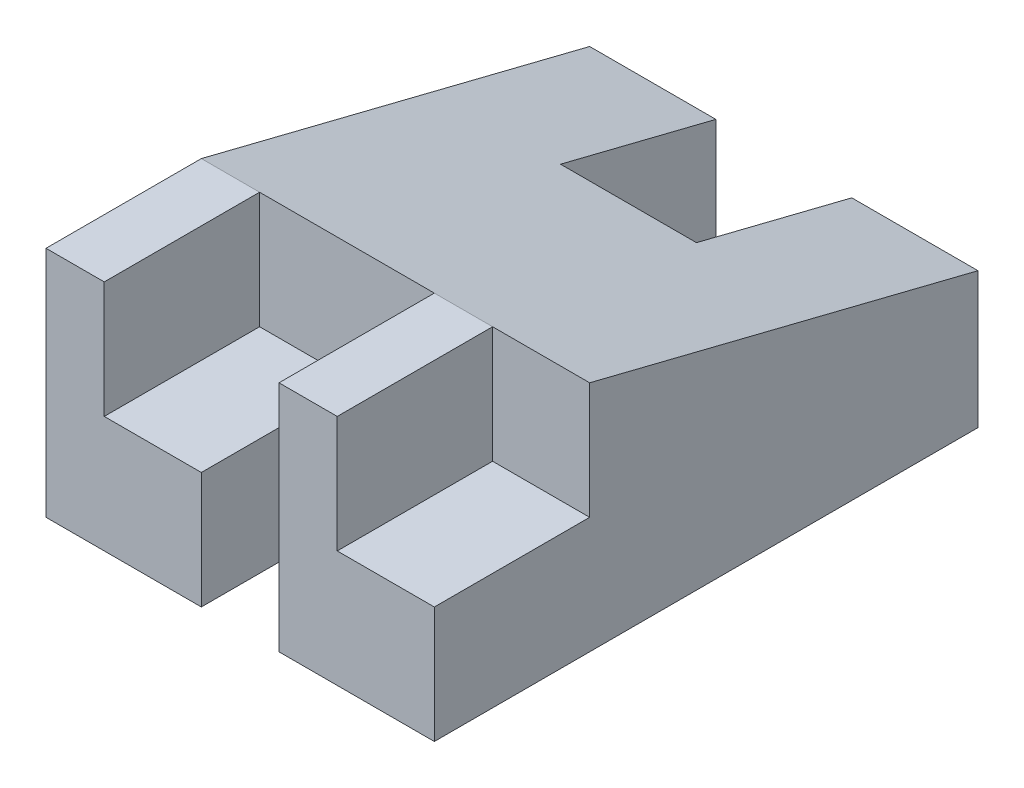
ISO-10303-21;
HEADER;
FILE_DESCRIPTION(('STEP AP214'),'2;1');
FILE_NAME('part.step','',(''),(''),'','','');
FILE_SCHEMA(('AUTOMOTIVE_DESIGN { 1 0 10303 214 1 1 1 1 }'));
ENDSEC;
DATA;
#1=APPLICATION_CONTEXT('core data for automotive mechanical design processes');
#2=APPLICATION_PROTOCOL_DEFINITION('international standard','automotive_design',2000,#1);
#3=PRODUCT_CONTEXT('',#1,'mechanical');
#4=PRODUCT('Part','Part','',(#3));
#5=PRODUCT_RELATED_PRODUCT_CATEGORY('part','',(#4));
#6=PRODUCT_DEFINITION_FORMATION('','',#4);
#7=PRODUCT_DEFINITION_CONTEXT('part definition',#1,'design');
#8=PRODUCT_DEFINITION('design','',#6,#7);
#9=PRODUCT_DEFINITION_SHAPE('','',#8);
#10=(LENGTH_UNIT() NAMED_UNIT(*) SI_UNIT(.MILLI.,.METRE.));
#11=(NAMED_UNIT(*) PLANE_ANGLE_UNIT() SI_UNIT($,.RADIAN.));
#12=(NAMED_UNIT(*) SI_UNIT($,.STERADIAN.) SOLID_ANGLE_UNIT());
#13=UNCERTAINTY_MEASURE_WITH_UNIT(LENGTH_MEASURE(1.E-05),#10,'distance_accuracy_value','');
#14=(GEOMETRIC_REPRESENTATION_CONTEXT(3) GLOBAL_UNCERTAINTY_ASSIGNED_CONTEXT((#13)) GLOBAL_UNIT_ASSIGNED_CONTEXT((#10,
#11,#12)) REPRESENTATION_CONTEXT('',''));
#15=CARTESIAN_POINT('',(0.,0.,0.));
#16=DIRECTION('',(0.,0.,1.));
#17=DIRECTION('',(1.,0.,0.));
#18=AXIS2_PLACEMENT_3D('',#15,#16,#17);
#19=CARTESIAN_POINT('',(-63.5,38.1,31.75));
#20=DIRECTION('',(0.,0.,1.));
#21=DIRECTION('',(0.,-1.,0.));
#22=AXIS2_PLACEMENT_3D('',#19,#20,#21);
#23=PLANE('',#22);
#24=DIRECTION('',(-1.,0.,0.));
#25=VECTOR('',#24,1.);
#26=CARTESIAN_POINT('',(-53.975,19.0499999999997,31.75));
#27=LINE('',#26,#25);
#28=CARTESIAN_POINT('',(-38.1,19.0499999999997,31.75));
#29=VERTEX_POINT('',#28);
#30=CARTESIAN_POINT('',(-53.975,19.0499999999997,31.75));
#31=VERTEX_POINT('',#30);
#32=EDGE_CURVE('E48',#29,#31,#27,.T.);
#33=ORIENTED_EDGE('',*,*,#32,.F.);
#34=DIRECTION('',(0.,1.,0.));
#35=VECTOR('',#34,1.);
#36=CARTESIAN_POINT('',(-38.1,19.0499999999997,31.75));
#37=LINE('',#36,#35);
#38=CARTESIAN_POINT('',(-38.1,0.,31.75));
#39=VERTEX_POINT('',#38);
#40=EDGE_CURVE('E174',#39,#29,#37,.T.);
#41=ORIENTED_EDGE('',*,*,#40,.F.);
#42=DIRECTION('',(1.,0.,0.));
#43=VECTOR('',#42,1.);
#44=CARTESIAN_POINT('',(-63.5,0.,31.75));
#45=LINE('',#44,#43);
#46=CARTESIAN_POINT('',(-25.4,0.,31.75));
#47=VERTEX_POINT('',#46);
#48=EDGE_CURVE('E248',#39,#47,#45,.T.);
#49=ORIENTED_EDGE('',*,*,#48,.T.);
#50=DIRECTION('',(0.,-1.,0.));
#51=VECTOR('',#50,1.);
#52=CARTESIAN_POINT('',(-25.4,0.,31.75));
#53=LINE('',#52,#51);
#54=CARTESIAN_POINT('',(-25.4,38.1,31.75));
#55=VERTEX_POINT('',#54);
#56=EDGE_CURVE('E188',#55,#47,#53,.T.);
#57=ORIENTED_EDGE('',*,*,#56,.F.);
#58=DIRECTION('',(1.,0.,0.));
#59=VECTOR('',#58,1.);
#60=CARTESIAN_POINT('',(-63.5,38.1,31.75));
#61=LINE('',#60,#59);
#62=CARTESIAN_POINT('',(-53.975,38.1,31.75));
#63=VERTEX_POINT('',#62);
#64=EDGE_CURVE('E263',#63,#55,#61,.T.);
#65=ORIENTED_EDGE('',*,*,#64,.F.);
#66=DIRECTION('',(0.,1.,0.));
#67=VECTOR('',#66,1.);
#68=CARTESIAN_POINT('',(-53.975,38.0999999999997,31.75));
#69=LINE('',#68,#67);
#70=EDGE_CURVE('E53',#31,#63,#69,.T.);
#71=ORIENTED_EDGE('',*,*,#70,.F.);
#72=EDGE_LOOP('',(#33,#41,#49,#57,#65,#71));
#73=FACE_BOUND('',#72,.T.);
#74=ADVANCED_FACE('F33',(#73),#23,.T.);
#75=CARTESIAN_POINT('',(-63.5,0.,-31.75));
#76=DIRECTION('',(0.,0.,-1.));
#77=DIRECTION('',(0.,1.,0.));
#78=AXIS2_PLACEMENT_3D('',#75,#76,#77);
#79=PLANE('',#78);
#80=DIRECTION('',(0.,1.,0.));
#81=VECTOR('',#80,1.);
#82=CARTESIAN_POINT('',(-20.6375,-1.2E-05,-31.75));
#83=LINE('',#82,#81);
#84=CARTESIAN_POINT('',(-20.6375,0.,-31.75));
#85=VERTEX_POINT('',#84);
#86=CARTESIAN_POINT('',(-20.6375,22.225,-31.75));
#87=VERTEX_POINT('',#86);
#88=EDGE_CURVE('E221',#85,#87,#83,.T.);
#89=ORIENTED_EDGE('',*,*,#88,.T.);
#90=DIRECTION('',(1.,0.,0.));
#91=VECTOR('',#90,1.);
#92=CARTESIAN_POINT('',(-63.5,22.225,-31.75));
#93=LINE('',#92,#91);
#94=CARTESIAN_POINT('',(0.,22.225,-31.75));
#95=VERTEX_POINT('',#94);
#96=EDGE_CURVE('E268',#87,#95,#93,.T.);
#97=ORIENTED_EDGE('',*,*,#96,.T.);
#98=DIRECTION('',(0.,1.,0.));
#99=VECTOR('',#98,1.);
#100=CARTESIAN_POINT('',(0.,0.,-31.75));
#101=LINE('',#100,#99);
#102=CARTESIAN_POINT('',(0.,0.,-31.75));
#103=VERTEX_POINT('',#102);
#104=EDGE_CURVE('E254',#103,#95,#101,.T.);
#105=ORIENTED_EDGE('',*,*,#104,.F.);
#106=DIRECTION('',(1.,0.,0.));
#107=VECTOR('',#106,1.);
#108=CARTESIAN_POINT('',(-63.5,0.,-31.75));
#109=LINE('',#108,#107);
#110=EDGE_CURVE('E272',#85,#103,#109,.T.);
#111=ORIENTED_EDGE('',*,*,#110,.F.);
#112=EDGE_LOOP('',(#89,#97,#105,#111));
#113=FACE_BOUND('',#112,.T.);
#114=ADVANCED_FACE('F302',(#113),#79,.T.);
#115=DIRECTION('',(0.,1.,0.));
#116=VECTOR('',#115,1.);
#117=CARTESIAN_POINT('',(-15.875,38.1,31.75));
#118=LINE('',#117,#116);
#119=CARTESIAN_POINT('',(-15.875,19.05,31.75));
#120=VERTEX_POINT('',#119);
#121=CARTESIAN_POINT('',(-15.875,38.1,31.75));
#122=VERTEX_POINT('',#121);
#123=EDGE_CURVE('E178',#120,#122,#118,.T.);
#124=ORIENTED_EDGE('',*,*,#123,.F.);
#125=DIRECTION('',(-1.,0.,0.));
#126=VECTOR('',#125,1.);
#127=CARTESIAN_POINT('',(-15.875,19.05,31.75));
#128=LINE('',#127,#126);
#129=CARTESIAN_POINT('',(0.,19.05,31.75));
#130=VERTEX_POINT('',#129);
#131=EDGE_CURVE('E175',#130,#120,#128,.T.);
#132=ORIENTED_EDGE('',*,*,#131,.F.);
#133=DIRECTION('',(0.,-1.,0.));
#134=VECTOR('',#133,1.);
#135=CARTESIAN_POINT('',(0.,38.1,31.75));
#136=LINE('',#135,#134);
#137=CARTESIAN_POINT('',(0.,38.1,31.75));
#138=VERTEX_POINT('',#137);
#139=EDGE_CURVE('E238',#138,#130,#136,.T.);
#140=ORIENTED_EDGE('',*,*,#139,.F.);
#141=EDGE_CURVE('E264',#122,#138,#61,.T.);
#142=ORIENTED_EDGE('',*,*,#141,.F.);
#143=EDGE_LOOP('',(#124,#132,#140,#142));
#144=FACE_BOUND('',#143,.T.);
#145=ADVANCED_FACE('F35',(#144),#23,.T.);
#146=CARTESIAN_POINT('',(-63.5,22.225,-31.75));
#147=DIRECTION('',(0.,0.970142500145332,-0.242535625036333));
#148=DIRECTION('',(0.,0.242535625036333,0.970142500145332));
#149=AXIS2_PLACEMENT_3D('',#146,#147,#148);
#150=PLANE('',#149);
#151=DIRECTION('',(0.,-0.242535625036333,-0.970142500145332));
#152=VECTOR('',#151,1.);
#153=CARTESIAN_POINT('',(-20.6375,22.225,-31.75));
#154=LINE('',#153,#152);
#155=CARTESIAN_POINT('',(-20.6375,28.575,-6.35));
#156=VERTEX_POINT('',#155);
#157=EDGE_CURVE('E236',#156,#87,#154,.T.);
#158=ORIENTED_EDGE('',*,*,#157,.F.);
#159=DIRECTION('',(1.,0.,0.));
#160=VECTOR('',#159,1.);
#161=CARTESIAN_POINT('',(-63.5,28.575,-6.35));
#162=LINE('',#161,#160);
#163=CARTESIAN_POINT('',(-42.8625,28.575,-6.35));
#164=VERTEX_POINT('',#163);
#165=EDGE_CURVE('E234',#164,#156,#162,.T.);
#166=ORIENTED_EDGE('',*,*,#165,.F.);
#167=DIRECTION('',(0.,0.242535625036333,0.970142500145332));
#168=VECTOR('',#167,1.);
#169=CARTESIAN_POINT('',(-42.8625,22.225,-31.75));
#170=LINE('',#169,#168);
#171=CARTESIAN_POINT('',(-42.8625,22.225,-31.75));
#172=VERTEX_POINT('',#171);
#173=EDGE_CURVE('E232',#172,#164,#170,.T.);
#174=ORIENTED_EDGE('',*,*,#173,.F.);
#175=CARTESIAN_POINT('',(-63.5,22.225,-31.75));
#176=VERTEX_POINT('',#175);
#177=EDGE_CURVE('E265',#176,#172,#93,.T.);
#178=ORIENTED_EDGE('',*,*,#177,.F.);
#179=DIRECTION('',(0.,0.242535625036333,0.970142500145332));
#180=VECTOR('',#179,1.);
#181=CARTESIAN_POINT('',(-63.5,22.225,-31.75));
#182=LINE('',#181,#180);
#183=CARTESIAN_POINT('',(-63.5,38.1,31.75));
#184=VERTEX_POINT('',#183);
#185=EDGE_CURVE('E246',#176,#184,#182,.T.);
#186=ORIENTED_EDGE('',*,*,#185,.T.);
#187=EDGE_CURVE('E259',#184,#63,#61,.T.);
#188=ORIENTED_EDGE('',*,*,#187,.T.);
#189=ORIENTED_EDGE('',*,*,#64,.T.);
#190=DIRECTION('',(-1.,0.,0.));
#191=VECTOR('',#190,1.);
#192=CARTESIAN_POINT('',(-25.4,38.1,31.75));
#193=LINE('',#192,#191);
#194=EDGE_CURVE('E202',#122,#55,#193,.T.);
#195=ORIENTED_EDGE('',*,*,#194,.F.);
#196=ORIENTED_EDGE('',*,*,#141,.T.);
#197=DIRECTION('',(0.,0.242535625036333,0.970142500145332));
#198=VECTOR('',#197,1.);
#199=CARTESIAN_POINT('',(0.,22.225,-31.75));
#200=LINE('',#199,#198);
#201=EDGE_CURVE('E243',#95,#138,#200,.T.);
#202=ORIENTED_EDGE('',*,*,#201,.F.);
#203=ORIENTED_EDGE('',*,*,#96,.F.);
#204=EDGE_LOOP('',(#158,#166,#174,#178,#186,#188,#189,#195,#196,#202,#203));
#205=FACE_BOUND('',#204,.T.);
#206=ADVANCED_FACE('F294',(#205),#150,.T.);
#207=DIRECTION('',(0.,1.,0.));
#208=VECTOR('',#207,1.);
#209=CARTESIAN_POINT('',(-42.8625,-1.2E-05,-31.75));
#210=LINE('',#209,#208);
#211=CARTESIAN_POINT('',(-42.8625,0.,-31.75));
#212=VERTEX_POINT('',#211);
#213=EDGE_CURVE('E224',#212,#172,#210,.T.);
#214=ORIENTED_EDGE('',*,*,#213,.F.);
#215=CARTESIAN_POINT('',(-63.5,0.,-31.75));
#216=VERTEX_POINT('',#215);
#217=EDGE_CURVE('E269',#216,#212,#109,.T.);
#218=ORIENTED_EDGE('',*,*,#217,.F.);
#219=DIRECTION('',(0.,1.,0.));
#220=VECTOR('',#219,1.);
#221=CARTESIAN_POINT('',(-63.5,0.,-31.75));
#222=LINE('',#221,#220);
#223=EDGE_CURVE('E242',#216,#176,#222,.T.);
#224=ORIENTED_EDGE('',*,*,#223,.T.);
#225=ORIENTED_EDGE('',*,*,#177,.T.);
#226=EDGE_LOOP('',(#214,#218,#224,#225));
#227=FACE_BOUND('',#226,.T.);
#228=ADVANCED_FACE('F289',(#227),#79,.T.);
#229=CARTESIAN_POINT('',(-63.5,0.,31.75));
#230=DIRECTION('',(0.,-1.,0.));
#231=DIRECTION('',(0.,0.,-1.));
#232=AXIS2_PLACEMENT_3D('',#229,#230,#231);
#233=PLANE('',#232);
#234=DIRECTION('',(0.,0.,1.));
#235=VECTOR('',#234,1.);
#236=CARTESIAN_POINT('',(-20.6375,0.,31.75));
#237=LINE('',#236,#235);
#238=CARTESIAN_POINT('',(-20.6375,0.,-6.35));
#239=VERTEX_POINT('',#238);
#240=EDGE_CURVE('E11',#85,#239,#237,.T.);
#241=ORIENTED_EDGE('',*,*,#240,.F.);
#242=ORIENTED_EDGE('',*,*,#110,.T.);
#243=DIRECTION('',(0.,0.,-1.));
#244=VECTOR('',#243,1.);
#245=CARTESIAN_POINT('',(0.,0.,31.75));
#246=LINE('',#245,#244);
#247=CARTESIAN_POINT('',(0.,0.,57.15));
#248=VERTEX_POINT('',#247);
#249=EDGE_CURVE('E251',#248,#103,#246,.T.);
#250=ORIENTED_EDGE('',*,*,#249,.F.);
#251=DIRECTION('',(1.,0.,0.));
#252=VECTOR('',#251,1.);
#253=CARTESIAN_POINT('',(0.,0.,57.15));
#254=LINE('',#253,#252);
#255=CARTESIAN_POINT('',(-25.4,0.,57.15));
#256=VERTEX_POINT('',#255);
#257=EDGE_CURVE('E196',#256,#248,#254,.T.);
#258=ORIENTED_EDGE('',*,*,#257,.F.);
#259=DIRECTION('',(0.,0.,-1.));
#260=VECTOR('',#259,1.);
#261=CARTESIAN_POINT('',(-25.4,0.,57.15));
#262=LINE('',#261,#260);
#263=EDGE_CURVE('E198',#256,#47,#262,.T.);
#264=ORIENTED_EDGE('',*,*,#263,.T.);
#265=ORIENTED_EDGE('',*,*,#48,.F.);
#266=DIRECTION('',(0.,0.,-1.));
#267=VECTOR('',#266,1.);
#268=CARTESIAN_POINT('',(-38.1,-2.66050878019847E-13,57.15));
#269=LINE('',#268,#267);
#270=CARTESIAN_POINT('',(-38.1,-2.66050878019847E-13,57.15));
#271=VERTEX_POINT('',#270);
#272=EDGE_CURVE('E319',#271,#39,#269,.T.);
#273=ORIENTED_EDGE('',*,*,#272,.F.);
#274=DIRECTION('',(1.,0.,0.));
#275=VECTOR('',#274,1.);
#276=CARTESIAN_POINT('',(-38.1,-2.66050878019847E-13,57.15));
#277=LINE('',#276,#275);
#278=CARTESIAN_POINT('',(-63.5,0.,57.15));
#279=VERTEX_POINT('',#278);
#280=EDGE_CURVE('E168',#279,#271,#277,.T.);
#281=ORIENTED_EDGE('',*,*,#280,.F.);
#282=DIRECTION('',(0.,0.,-1.));
#283=VECTOR('',#282,1.);
#284=CARTESIAN_POINT('',(-63.5,0.,31.75));
#285=LINE('',#284,#283);
#286=EDGE_CURVE('E239',#279,#216,#285,.T.);
#287=ORIENTED_EDGE('',*,*,#286,.T.);
#288=ORIENTED_EDGE('',*,*,#217,.T.);
#289=DIRECTION('',(0.,0.,-1.));
#290=VECTOR('',#289,1.);
#291=CARTESIAN_POINT('',(-42.8625,0.,31.75));
#292=LINE('',#291,#290);
#293=CARTESIAN_POINT('',(-42.8625,0.,-6.35));
#294=VERTEX_POINT('',#293);
#295=EDGE_CURVE('E262',#294,#212,#292,.T.);
#296=ORIENTED_EDGE('',*,*,#295,.F.);
#297=DIRECTION('',(-1.,0.,0.));
#298=VECTOR('',#297,1.);
#299=CARTESIAN_POINT('',(-63.5,0.,-6.35));
#300=LINE('',#299,#298);
#301=EDGE_CURVE('E41',#239,#294,#300,.T.);
#302=ORIENTED_EDGE('',*,*,#301,.F.);
#303=EDGE_LOOP('',(#241,#242,#250,#258,#264,#265,#273,#281,#287,#288,#296,#302));
#304=FACE_BOUND('',#303,.T.);
#305=ADVANCED_FACE('F283',(#304),#233,.T.);
#306=CARTESIAN_POINT('',(-63.5,0.,0.));
#307=DIRECTION('',(1.,0.,0.));
#308=DIRECTION('',(0.,0.,-1.));
#309=AXIS2_PLACEMENT_3D('',#306,#307,#308);
#310=PLANE('',#309);
#311=ORIENTED_EDGE('',*,*,#286,.F.);
#312=DIRECTION('',(0.,-1.,0.));
#313=VECTOR('',#312,1.);
#314=CARTESIAN_POINT('',(-63.5,0.,57.15));
#315=LINE('',#314,#313);
#316=CARTESIAN_POINT('',(-63.5,38.0999999999997,57.15));
#317=VERTEX_POINT('',#316);
#318=EDGE_CURVE('E324',#317,#279,#315,.T.);
#319=ORIENTED_EDGE('',*,*,#318,.F.);
#320=DIRECTION('',(0.,0.,-1.));
#321=VECTOR('',#320,1.);
#322=CARTESIAN_POINT('',(-63.5,38.0999999999997,57.15));
#323=LINE('',#322,#321);
#324=EDGE_CURVE('E320',#317,#184,#323,.T.);
#325=ORIENTED_EDGE('',*,*,#324,.T.);
#326=ORIENTED_EDGE('',*,*,#185,.F.);
#327=ORIENTED_EDGE('',*,*,#223,.F.);
#328=EDGE_LOOP('',(#311,#319,#325,#326,#327));
#329=FACE_BOUND('',#328,.T.);
#330=ADVANCED_FACE('F343',(#329),#310,.F.);
#331=CARTESIAN_POINT('',(0.,0.,0.));
#332=DIRECTION('',(1.,0.,0.));
#333=DIRECTION('',(0.,0.,-1.));
#334=AXIS2_PLACEMENT_3D('',#331,#332,#333);
#335=PLANE('',#334);
#336=ORIENTED_EDGE('',*,*,#139,.T.);
#337=DIRECTION('',(0.,0.,-1.));
#338=VECTOR('',#337,1.);
#339=CARTESIAN_POINT('',(0.,19.05,57.15));
#340=LINE('',#339,#338);
#341=CARTESIAN_POINT('',(0.,19.05,57.15));
#342=VERTEX_POINT('',#341);
#343=EDGE_CURVE('E218',#342,#130,#340,.T.);
#344=ORIENTED_EDGE('',*,*,#343,.F.);
#345=DIRECTION('',(0.,1.,0.));
#346=VECTOR('',#345,1.);
#347=CARTESIAN_POINT('',(0.,19.05,57.15));
#348=LINE('',#347,#346);
#349=EDGE_CURVE('E184',#248,#342,#348,.T.);
#350=ORIENTED_EDGE('',*,*,#349,.F.);
#351=ORIENTED_EDGE('',*,*,#249,.T.);
#352=ORIENTED_EDGE('',*,*,#104,.T.);
#353=ORIENTED_EDGE('',*,*,#201,.T.);
#354=EDGE_LOOP('',(#336,#344,#350,#351,#352,#353));
#355=FACE_BOUND('',#354,.T.);
#356=ADVANCED_FACE('F306',(#355),#335,.T.);
#357=CARTESIAN_POINT('',(-20.6375,-1.2E-05,0.));
#358=DIRECTION('',(1.,0.,0.));
#359=DIRECTION('',(0.,0.,-1.));
#360=AXIS2_PLACEMENT_3D('',#357,#358,#359);
#361=PLANE('',#360);
#362=ORIENTED_EDGE('',*,*,#157,.T.);
#363=ORIENTED_EDGE('',*,*,#88,.F.);
#364=ORIENTED_EDGE('',*,*,#240,.T.);
#365=DIRECTION('',(0.,1.,0.));
#366=VECTOR('',#365,1.);
#367=CARTESIAN_POINT('',(-20.6375,-1.2E-05,-6.35));
#368=LINE('',#367,#366);
#369=EDGE_CURVE('E229',#239,#156,#368,.T.);
#370=ORIENTED_EDGE('',*,*,#369,.T.);
#371=EDGE_LOOP('',(#362,#363,#364,#370));
#372=FACE_BOUND('',#371,.T.);
#373=ADVANCED_FACE('F298',(#372),#361,.F.);
#374=CARTESIAN_POINT('',(0.,-1.2E-05,-6.35));
#375=DIRECTION('',(0.,0.,1.));
#376=DIRECTION('',(1.,0.,0.));
#377=AXIS2_PLACEMENT_3D('',#374,#375,#376);
#378=PLANE('',#377);
#379=ORIENTED_EDGE('',*,*,#165,.T.);
#380=ORIENTED_EDGE('',*,*,#369,.F.);
#381=ORIENTED_EDGE('',*,*,#301,.T.);
#382=DIRECTION('',(0.,1.,0.));
#383=VECTOR('',#382,1.);
#384=CARTESIAN_POINT('',(-42.8625,-1.2E-05,-6.35));
#385=LINE('',#384,#383);
#386=EDGE_CURVE('E226',#294,#164,#385,.T.);
#387=ORIENTED_EDGE('',*,*,#386,.T.);
#388=EDGE_LOOP('',(#379,#380,#381,#387));
#389=FACE_BOUND('',#388,.T.);
#390=ADVANCED_FACE('F279',(#389),#378,.F.);
#391=CARTESIAN_POINT('',(-42.8625,-1.2E-05,0.));
#392=DIRECTION('',(-1.,0.,0.));
#393=DIRECTION('',(0.,0.,1.));
#394=AXIS2_PLACEMENT_3D('',#391,#392,#393);
#395=PLANE('',#394);
#396=ORIENTED_EDGE('',*,*,#173,.T.);
#397=ORIENTED_EDGE('',*,*,#386,.F.);
#398=ORIENTED_EDGE('',*,*,#295,.T.);
#399=ORIENTED_EDGE('',*,*,#213,.T.);
#400=EDGE_LOOP('',(#396,#397,#398,#399));
#401=FACE_BOUND('',#400,.T.);
#402=ADVANCED_FACE('F286',(#401),#395,.F.);
#403=CARTESIAN_POINT('',(-15.875,19.05,57.15));
#404=DIRECTION('',(0.,-1.,0.));
#405=DIRECTION('',(1.,0.,0.));
#406=AXIS2_PLACEMENT_3D('',#403,#404,#405);
#407=PLANE('',#406);
#408=ORIENTED_EDGE('',*,*,#131,.T.);
#409=DIRECTION('',(0.,0.,-1.));
#410=VECTOR('',#409,1.);
#411=CARTESIAN_POINT('',(-15.875,19.05,57.15));
#412=LINE('',#411,#410);
#413=CARTESIAN_POINT('',(-15.875,19.05,57.15));
#414=VERTEX_POINT('',#413);
#415=EDGE_CURVE('E215',#414,#120,#412,.T.);
#416=ORIENTED_EDGE('',*,*,#415,.F.);
#417=DIRECTION('',(-1.,0.,0.));
#418=VECTOR('',#417,1.);
#419=CARTESIAN_POINT('',(-15.875,19.05,57.15));
#420=LINE('',#419,#418);
#421=EDGE_CURVE('E187',#342,#414,#420,.T.);
#422=ORIENTED_EDGE('',*,*,#421,.F.);
#423=ORIENTED_EDGE('',*,*,#343,.T.);
#424=EDGE_LOOP('',(#408,#416,#422,#423));
#425=FACE_BOUND('',#424,.T.);
#426=ADVANCED_FACE('F369',(#425),#407,.F.);
#427=CARTESIAN_POINT('',(-15.875,38.1,57.15));
#428=DIRECTION('',(-1.,0.,0.));
#429=DIRECTION('',(0.,-1.,0.));
#430=AXIS2_PLACEMENT_3D('',#427,#428,#429);
#431=PLANE('',#430);
#432=ORIENTED_EDGE('',*,*,#123,.T.);
#433=DIRECTION('',(0.,0.,-1.));
#434=VECTOR('',#433,1.);
#435=CARTESIAN_POINT('',(-15.875,38.1,57.15));
#436=LINE('',#435,#434);
#437=CARTESIAN_POINT('',(-15.875,38.1,57.15));
#438=VERTEX_POINT('',#437);
#439=EDGE_CURVE('E212',#438,#122,#436,.T.);
#440=ORIENTED_EDGE('',*,*,#439,.F.);
#441=DIRECTION('',(0.,1.,0.));
#442=VECTOR('',#441,1.);
#443=CARTESIAN_POINT('',(-15.875,38.1,57.15));
#444=LINE('',#443,#442);
#445=EDGE_CURVE('E190',#414,#438,#444,.T.);
#446=ORIENTED_EDGE('',*,*,#445,.F.);
#447=ORIENTED_EDGE('',*,*,#415,.T.);
#448=EDGE_LOOP('',(#432,#440,#446,#447));
#449=FACE_BOUND('',#448,.T.);
#450=ADVANCED_FACE('F371',(#449),#431,.F.);
#451=CARTESIAN_POINT('',(-25.4,38.1,57.15));
#452=DIRECTION('',(0.,-1.,0.));
#453=DIRECTION('',(0.,0.,-1.));
#454=AXIS2_PLACEMENT_3D('',#451,#452,#453);
#455=PLANE('',#454);
#456=ORIENTED_EDGE('',*,*,#194,.T.);
#457=DIRECTION('',(0.,0.,-1.));
#458=VECTOR('',#457,1.);
#459=CARTESIAN_POINT('',(-25.4,38.1,57.15));
#460=LINE('',#459,#458);
#461=CARTESIAN_POINT('',(-25.4,38.1,57.15));
#462=VERTEX_POINT('',#461);
#463=EDGE_CURVE('E209',#462,#55,#460,.T.);
#464=ORIENTED_EDGE('',*,*,#463,.F.);
#465=DIRECTION('',(-1.,0.,0.));
#466=VECTOR('',#465,1.);
#467=CARTESIAN_POINT('',(-25.4,38.1,57.15));
#468=LINE('',#467,#466);
#469=EDGE_CURVE('E192',#438,#462,#468,.T.);
#470=ORIENTED_EDGE('',*,*,#469,.F.);
#471=ORIENTED_EDGE('',*,*,#439,.T.);
#472=EDGE_LOOP('',(#456,#464,#470,#471));
#473=FACE_BOUND('',#472,.T.);
#474=ADVANCED_FACE('F373',(#473),#455,.F.);
#475=CARTESIAN_POINT('',(-25.4,0.,57.15));
#476=DIRECTION('',(1.,0.,0.));
#477=DIRECTION('',(0.,0.,-1.));
#478=AXIS2_PLACEMENT_3D('',#475,#476,#477);
#479=PLANE('',#478);
#480=ORIENTED_EDGE('',*,*,#56,.T.);
#481=ORIENTED_EDGE('',*,*,#263,.F.);
#482=DIRECTION('',(0.,-1.,0.));
#483=VECTOR('',#482,1.);
#484=CARTESIAN_POINT('',(-25.4,0.,57.15));
#485=LINE('',#484,#483);
#486=EDGE_CURVE('E194',#462,#256,#485,.T.);
#487=ORIENTED_EDGE('',*,*,#486,.F.);
#488=ORIENTED_EDGE('',*,*,#463,.T.);
#489=EDGE_LOOP('',(#480,#481,#487,#488));
#490=FACE_BOUND('',#489,.T.);
#491=ADVANCED_FACE('F316',(#490),#479,.F.);
#492=CARTESIAN_POINT('',(0.,0.,57.15));
#493=DIRECTION('',(0.,0.,-1.));
#494=DIRECTION('',(-1.,0.,0.));
#495=AXIS2_PLACEMENT_3D('',#492,#493,#494);
#496=PLANE('',#495);
#497=ORIENTED_EDGE('',*,*,#349,.T.);
#498=ORIENTED_EDGE('',*,*,#421,.T.);
#499=ORIENTED_EDGE('',*,*,#445,.T.);
#500=ORIENTED_EDGE('',*,*,#469,.T.);
#501=ORIENTED_EDGE('',*,*,#486,.T.);
#502=ORIENTED_EDGE('',*,*,#257,.T.);
#503=EDGE_LOOP('',(#497,#498,#499,#500,#501,#502));
#504=FACE_BOUND('',#503,.T.);
#505=ADVANCED_FACE('F310',(#504),#496,.F.);
#506=CARTESIAN_POINT('',(-38.1,19.0499999999997,57.15));
#507=DIRECTION('',(-1.,0.,0.));
#508=DIRECTION('',(0.,0.,1.));
#509=AXIS2_PLACEMENT_3D('',#506,#507,#508);
#510=PLANE('',#509);
#511=ORIENTED_EDGE('',*,*,#40,.T.);
#512=DIRECTION('',(0.,0.,-1.));
#513=VECTOR('',#512,1.);
#514=CARTESIAN_POINT('',(-38.1,19.0499999999997,57.15));
#515=LINE('',#514,#513);
#516=CARTESIAN_POINT('',(-38.1,19.0499999999997,57.15));
#517=VERTEX_POINT('',#516);
#518=EDGE_CURVE('E155',#517,#29,#515,.T.);
#519=ORIENTED_EDGE('',*,*,#518,.F.);
#520=DIRECTION('',(0.,1.,0.));
#521=VECTOR('',#520,1.);
#522=CARTESIAN_POINT('',(-38.1,19.0499999999997,57.15));
#523=LINE('',#522,#521);
#524=EDGE_CURVE('E162',#271,#517,#523,.T.);
#525=ORIENTED_EDGE('',*,*,#524,.F.);
#526=ORIENTED_EDGE('',*,*,#272,.T.);
#527=EDGE_LOOP('',(#511,#519,#525,#526));
#528=FACE_BOUND('',#527,.T.);
#529=ADVANCED_FACE('F173',(#528),#510,.F.);
#530=CARTESIAN_POINT('',(-53.975,19.0499999999997,57.15));
#531=DIRECTION('',(0.,-1.,0.));
#532=DIRECTION('',(0.,0.,-1.));
#533=AXIS2_PLACEMENT_3D('',#530,#531,#532);
#534=PLANE('',#533);
#535=ORIENTED_EDGE('',*,*,#32,.T.);
#536=DIRECTION('',(0.,0.,-1.));
#537=VECTOR('',#536,1.);
#538=CARTESIAN_POINT('',(-53.975,19.0499999999997,57.15));
#539=LINE('',#538,#537);
#540=CARTESIAN_POINT('',(-53.975,19.0499999999997,57.15));
#541=VERTEX_POINT('',#540);
#542=EDGE_CURVE('E158',#541,#31,#539,.T.);
#543=ORIENTED_EDGE('',*,*,#542,.F.);
#544=DIRECTION('',(-1.,0.,0.));
#545=VECTOR('',#544,1.);
#546=CARTESIAN_POINT('',(-53.975,19.0499999999997,57.15));
#547=LINE('',#546,#545);
#548=EDGE_CURVE('E151',#517,#541,#547,.T.);
#549=ORIENTED_EDGE('',*,*,#548,.F.);
#550=ORIENTED_EDGE('',*,*,#518,.T.);
#551=EDGE_LOOP('',(#535,#543,#549,#550));
#552=FACE_BOUND('',#551,.T.);
#553=ADVANCED_FACE('F153',(#552),#534,.F.);
#554=CARTESIAN_POINT('',(-53.975,38.0999999999997,57.15));
#555=DIRECTION('',(-1.,0.,0.));
#556=DIRECTION('',(0.,0.,1.));
#557=AXIS2_PLACEMENT_3D('',#554,#555,#556);
#558=PLANE('',#557);
#559=ORIENTED_EDGE('',*,*,#70,.T.);
#560=DIRECTION('',(0.,0.,-1.));
#561=VECTOR('',#560,1.);
#562=CARTESIAN_POINT('',(-53.975,38.0999999999997,57.15));
#563=LINE('',#562,#561);
#564=CARTESIAN_POINT('',(-53.975,38.0999999999997,57.15));
#565=VERTEX_POINT('',#564);
#566=EDGE_CURVE('E180',#565,#63,#563,.T.);
#567=ORIENTED_EDGE('',*,*,#566,.F.);
#568=DIRECTION('',(0.,1.,0.));
#569=VECTOR('',#568,1.);
#570=CARTESIAN_POINT('',(-53.975,38.0999999999997,57.15));
#571=LINE('',#570,#569);
#572=EDGE_CURVE('E161',#541,#565,#571,.T.);
#573=ORIENTED_EDGE('',*,*,#572,.F.);
#574=ORIENTED_EDGE('',*,*,#542,.T.);
#575=EDGE_LOOP('',(#559,#567,#573,#574));
#576=FACE_BOUND('',#575,.T.);
#577=ADVANCED_FACE('F336',(#576),#558,.F.);
#578=CARTESIAN_POINT('',(-63.5,38.0999999999997,57.15));
#579=DIRECTION('',(0.,-1.,0.));
#580=DIRECTION('',(0.,0.,-1.));
#581=AXIS2_PLACEMENT_3D('',#578,#579,#580);
#582=PLANE('',#581);
#583=ORIENTED_EDGE('',*,*,#187,.F.);
#584=ORIENTED_EDGE('',*,*,#324,.F.);
#585=DIRECTION('',(-1.,0.,0.));
#586=VECTOR('',#585,1.);
#587=CARTESIAN_POINT('',(-63.5,38.0999999999997,57.15));
#588=LINE('',#587,#586);
#589=EDGE_CURVE('E334',#565,#317,#588,.T.);
#590=ORIENTED_EDGE('',*,*,#589,.F.);
#591=ORIENTED_EDGE('',*,*,#566,.T.);
#592=EDGE_LOOP('',(#583,#584,#590,#591));
#593=FACE_BOUND('',#592,.T.);
#594=ADVANCED_FACE('F332',(#593),#582,.F.);
#595=CARTESIAN_POINT('',(0.,0.,57.15));
#596=DIRECTION('',(0.,0.,-1.));
#597=DIRECTION('',(-1.,0.,0.));
#598=AXIS2_PLACEMENT_3D('',#595,#596,#597);
#599=PLANE('',#598);
#600=ORIENTED_EDGE('',*,*,#524,.T.);
#601=ORIENTED_EDGE('',*,*,#548,.T.);
#602=ORIENTED_EDGE('',*,*,#572,.T.);
#603=ORIENTED_EDGE('',*,*,#589,.T.);
#604=ORIENTED_EDGE('',*,*,#318,.T.);
#605=ORIENTED_EDGE('',*,*,#280,.T.);
#606=EDGE_LOOP('',(#600,#601,#602,#603,#604,#605));
#607=FACE_BOUND('',#606,.T.);
#608=ADVANCED_FACE('F165',(#607),#599,.F.);
#609=CLOSED_SHELL('',(#74,#114,#145,#206,#228,#305,#330,#356,#373,#390,#402,#426,#450,#474,#491,
#505,#529,#553,#577,#594,#608));
#610=MANIFOLD_SOLID_BREP('B2',#609);
#611=ADVANCED_BREP_SHAPE_REPRESENTATION('',(#18,#610),#14);
#612=SHAPE_DEFINITION_REPRESENTATION(#9,#611);
ENDSEC;
END-ISO-10303-21;
